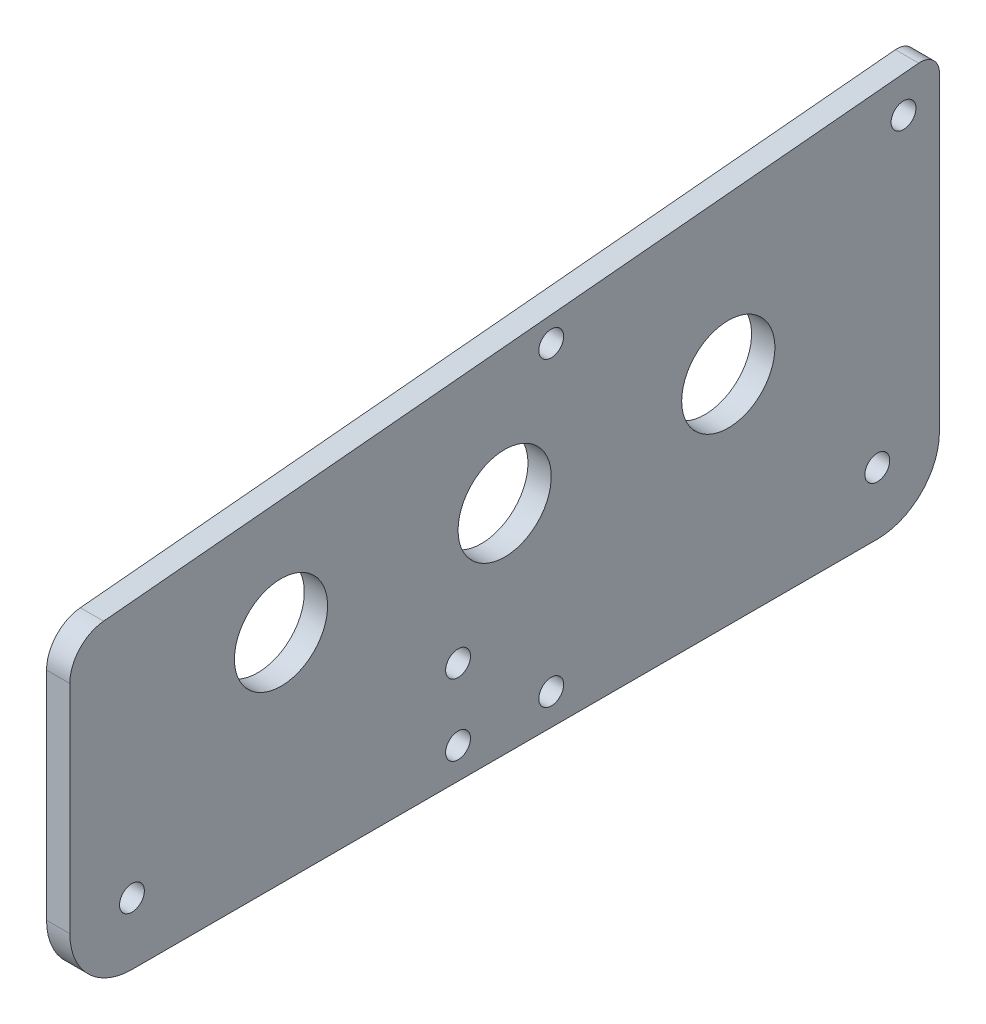
ISO-10303-21;
HEADER;
FILE_DESCRIPTION(('STEP AP214'),'2;1');
FILE_NAME('part.step','',(''),(''),'','','');
FILE_SCHEMA(('AUTOMOTIVE_DESIGN { 1 0 10303 214 1 1 1 1 }'));
ENDSEC;
DATA;
#1=APPLICATION_CONTEXT('core data for automotive mechanical design processes');
#2=APPLICATION_PROTOCOL_DEFINITION('international standard','automotive_design',2000,#1);
#3=PRODUCT_CONTEXT('',#1,'mechanical');
#4=PRODUCT('Part','Part','',(#3));
#5=PRODUCT_RELATED_PRODUCT_CATEGORY('part','',(#4));
#6=PRODUCT_DEFINITION_FORMATION('','',#4);
#7=PRODUCT_DEFINITION_CONTEXT('part definition',#1,'design');
#8=PRODUCT_DEFINITION('design','',#6,#7);
#9=PRODUCT_DEFINITION_SHAPE('','',#8);
#10=(LENGTH_UNIT() NAMED_UNIT(*) SI_UNIT(.MILLI.,.METRE.));
#11=(NAMED_UNIT(*) PLANE_ANGLE_UNIT() SI_UNIT($,.RADIAN.));
#12=(NAMED_UNIT(*) SI_UNIT($,.STERADIAN.) SOLID_ANGLE_UNIT());
#13=UNCERTAINTY_MEASURE_WITH_UNIT(LENGTH_MEASURE(1.E-05),#10,'distance_accuracy_value','');
#14=(GEOMETRIC_REPRESENTATION_CONTEXT(3) GLOBAL_UNCERTAINTY_ASSIGNED_CONTEXT((#13)) GLOBAL_UNIT_ASSIGNED_CONTEXT((#10,
#11,#12)) REPRESENTATION_CONTEXT('',''));
#15=CARTESIAN_POINT('',(0.,0.,0.));
#16=DIRECTION('',(0.,0.,1.));
#17=DIRECTION('',(1.,0.,0.));
#18=AXIS2_PLACEMENT_3D('',#15,#16,#17);
#19=CARTESIAN_POINT('',(4.7625,43.2742885665233,519.572478048036));
#20=DIRECTION('',(1.,0.,0.));
#21=DIRECTION('',(0.,0.,1.));
#22=AXIS2_PLACEMENT_3D('',#19,#20,#21);
#23=CYLINDRICAL_SURFACE('',#22,12.7);
#24=DIRECTION('',(1.,0.,0.));
#25=VECTOR('',#24,1.);
#26=CARTESIAN_POINT('',(4.7625,43.2742885665234,506.872478048036));
#27=LINE('',#26,#25);
#28=CARTESIAN_POINT('',(0.,43.2742885665234,506.872478048036));
#29=VERTEX_POINT('',#28);
#30=CARTESIAN_POINT('',(4.7625,43.2742885665234,506.872478048036));
#31=VERTEX_POINT('',#30);
#32=EDGE_CURVE('E11',#29,#31,#27,.T.);
#33=ORIENTED_EDGE('',*,*,#32,.T.);
#34=CARTESIAN_POINT('',(4.7625,43.2742885665233,519.572478048036));
#35=DIRECTION('',(-1.,0.,0.));
#36=DIRECTION('',(0.,0.,1.));
#37=AXIS2_PLACEMENT_3D('',#34,#35,#36);
#38=CIRCLE('',#37,12.7);
#39=CARTESIAN_POINT('',(4.7625,30.5742885665233,519.572478048036));
#40=VERTEX_POINT('',#39);
#41=EDGE_CURVE('E189',#31,#40,#38,.T.);
#42=ORIENTED_EDGE('',*,*,#41,.T.);
#43=DIRECTION('',(1.,0.,0.));
#44=VECTOR('',#43,1.);
#45=CARTESIAN_POINT('',(4.7625,30.5742885665233,519.572478048036));
#46=LINE('',#45,#44);
#47=CARTESIAN_POINT('',(0.,30.5742885665233,519.572478048036));
#48=VERTEX_POINT('',#47);
#49=EDGE_CURVE('E47',#48,#40,#46,.T.);
#50=ORIENTED_EDGE('',*,*,#49,.F.);
#51=CARTESIAN_POINT('',(0.,43.2742885665233,519.572478048036));
#52=DIRECTION('',(-1.,0.,0.));
#53=DIRECTION('',(0.,0.,1.));
#54=AXIS2_PLACEMENT_3D('',#51,#52,#53);
#55=CIRCLE('',#54,12.7);
#56=EDGE_CURVE('E93',#29,#48,#55,.T.);
#57=ORIENTED_EDGE('',*,*,#56,.F.);
#58=EDGE_LOOP('',(#33,#42,#50,#57));
#59=FACE_BOUND('',#58,.T.);
#60=ADVANCED_FACE('F37',(#59),#23,.T.);
#61=CARTESIAN_POINT('',(4.7625,30.5742885665233,671.972478048036));
#62=DIRECTION('',(0.,-1.,0.));
#63=DIRECTION('',(0.,0.,1.));
#64=AXIS2_PLACEMENT_3D('',#61,#62,#63);
#65=PLANE('',#64);
#66=ORIENTED_EDGE('',*,*,#49,.T.);
#67=DIRECTION('',(0.,0.,1.));
#68=VECTOR('',#67,1.);
#69=CARTESIAN_POINT('',(4.7625,30.5742885665233,671.972478048036));
#70=LINE('',#69,#68);
#71=CARTESIAN_POINT('',(4.7625,30.5742885665233,671.972478048036));
#72=VERTEX_POINT('',#71);
#73=EDGE_CURVE('E184',#40,#72,#70,.T.);
#74=ORIENTED_EDGE('',*,*,#73,.T.);
#75=DIRECTION('',(1.,0.,0.));
#76=VECTOR('',#75,1.);
#77=CARTESIAN_POINT('',(4.7625,30.5742885665233,671.972478048036));
#78=LINE('',#77,#76);
#79=CARTESIAN_POINT('',(0.,30.5742885665233,671.972478048036));
#80=VERTEX_POINT('',#79);
#81=EDGE_CURVE('E171',#80,#72,#78,.T.);
#82=ORIENTED_EDGE('',*,*,#81,.F.);
#83=DIRECTION('',(0.,0.,1.));
#84=VECTOR('',#83,1.);
#85=CARTESIAN_POINT('',(0.,30.5742885665233,510.75512339621));
#86=LINE('',#85,#84);
#87=EDGE_CURVE('E144',#48,#80,#86,.T.);
#88=ORIENTED_EDGE('',*,*,#87,.F.);
#89=EDGE_LOOP('',(#66,#74,#82,#88));
#90=FACE_BOUND('',#89,.T.);
#91=ADVANCED_FACE('F180',(#90),#65,.T.);
#92=CARTESIAN_POINT('',(4.7625,43.2742885665233,671.972478048036));
#93=DIRECTION('',(1.,0.,0.));
#94=DIRECTION('',(0.,0.,1.));
#95=AXIS2_PLACEMENT_3D('',#92,#93,#94);
#96=CYLINDRICAL_SURFACE('',#95,12.7);
#97=ORIENTED_EDGE('',*,*,#81,.T.);
#98=CARTESIAN_POINT('',(4.7625,43.2742885665233,671.972478048036));
#99=DIRECTION('',(-1.,0.,0.));
#100=DIRECTION('',(0.,0.,1.));
#101=AXIS2_PLACEMENT_3D('',#98,#99,#100);
#102=CIRCLE('',#101,12.7);
#103=CARTESIAN_POINT('',(4.7625,43.2742885665234,684.672478048036));
#104=VERTEX_POINT('',#103);
#105=EDGE_CURVE('E192',#72,#104,#102,.T.);
#106=ORIENTED_EDGE('',*,*,#105,.T.);
#107=DIRECTION('',(1.,0.,0.));
#108=VECTOR('',#107,1.);
#109=CARTESIAN_POINT('',(4.7625,43.2742885665234,684.672478048036));
#110=LINE('',#109,#108);
#111=CARTESIAN_POINT('',(0.,43.2742885665234,684.672478048036));
#112=VERTEX_POINT('',#111);
#113=EDGE_CURVE('E168',#112,#104,#110,.T.);
#114=ORIENTED_EDGE('',*,*,#113,.F.);
#115=CARTESIAN_POINT('',(0.,43.2742885665233,671.972478048036));
#116=DIRECTION('',(-1.,0.,0.));
#117=DIRECTION('',(0.,0.,1.));
#118=AXIS2_PLACEMENT_3D('',#115,#116,#117);
#119=CIRCLE('',#118,12.7);
#120=EDGE_CURVE('E141',#80,#112,#119,.T.);
#121=ORIENTED_EDGE('',*,*,#120,.F.);
#122=EDGE_LOOP('',(#97,#106,#114,#121));
#123=FACE_BOUND('',#122,.T.);
#124=ADVANCED_FACE('F249',(#123),#96,.T.);
#125=CARTESIAN_POINT('',(4.7625,87.5685067589977,684.672478048036));
#126=DIRECTION('',(0.,0.,1.));
#127=DIRECTION('',(0.,1.,0.));
#128=AXIS2_PLACEMENT_3D('',#125,#126,#127);
#129=PLANE('',#128);
#130=ORIENTED_EDGE('',*,*,#113,.T.);
#131=DIRECTION('',(0.,1.,0.));
#132=VECTOR('',#131,1.);
#133=CARTESIAN_POINT('',(4.7625,87.5685067589977,684.672478048036));
#134=LINE('',#133,#132);
#135=CARTESIAN_POINT('',(4.7625,87.5685067589977,684.672478048036));
#136=VERTEX_POINT('',#135);
#137=EDGE_CURVE('E199',#104,#136,#134,.T.);
#138=ORIENTED_EDGE('',*,*,#137,.T.);
#139=DIRECTION('',(1.,0.,0.));
#140=VECTOR('',#139,1.);
#141=CARTESIAN_POINT('',(4.7625,87.5685067589977,684.672478048036));
#142=LINE('',#141,#140);
#143=CARTESIAN_POINT('',(0.,87.5685067589977,684.672478048036));
#144=VERTEX_POINT('',#143);
#145=EDGE_CURVE('E165',#144,#136,#142,.T.);
#146=ORIENTED_EDGE('',*,*,#145,.F.);
#147=DIRECTION('',(0.,1.,0.));
#148=VECTOR('',#147,1.);
#149=CARTESIAN_POINT('',(0.,106.774288566523,684.672478048036));
#150=LINE('',#149,#148);
#151=EDGE_CURVE('E138',#112,#144,#150,.T.);
#152=ORIENTED_EDGE('',*,*,#151,.F.);
#153=EDGE_LOOP('',(#130,#138,#146,#152));
#154=FACE_BOUND('',#153,.T.);
#155=ADVANCED_FACE('F339',(#154),#129,.T.);
#156=CARTESIAN_POINT('',(4.7625,87.5685067589978,677.052478048036));
#157=DIRECTION('',(1.,0.,0.));
#158=DIRECTION('',(0.,0.,1.));
#159=AXIS2_PLACEMENT_3D('',#156,#157,#158);
#160=CYLINDRICAL_SURFACE('',#159,7.61999999999997);
#161=ORIENTED_EDGE('',*,*,#145,.T.);
#162=CARTESIAN_POINT('',(4.7625,87.5685067589978,677.052478048036));
#163=DIRECTION('',(-1.,0.,0.));
#164=DIRECTION('',(0.,0.,1.));
#165=AXIS2_PLACEMENT_3D('',#162,#163,#164);
#166=CIRCLE('',#165,7.61999999999997);
#167=CARTESIAN_POINT('',(4.7625,95.1558223329558,677.757490375002));
#168=VERTEX_POINT('',#167);
#169=EDGE_CURVE('E202',#136,#168,#166,.T.);
#170=ORIENTED_EDGE('',*,*,#169,.T.);
#171=DIRECTION('',(1.,0.,0.));
#172=VECTOR('',#171,1.);
#173=CARTESIAN_POINT('',(4.7625,95.1558223329558,677.757490375002));
#174=LINE('',#173,#172);
#175=CARTESIAN_POINT('',(0.,95.1558223329558,677.757490375002));
#176=VERTEX_POINT('',#175);
#177=EDGE_CURVE('E108',#176,#168,#174,.T.);
#178=ORIENTED_EDGE('',*,*,#177,.F.);
#179=CARTESIAN_POINT('',(0.,87.5685067589978,677.052478048036));
#180=DIRECTION('',(-1.,0.,0.));
#181=DIRECTION('',(0.,0.,1.));
#182=AXIS2_PLACEMENT_3D('',#179,#180,#181);
#183=CIRCLE('',#182,7.61999999999997);
#184=EDGE_CURVE('E136',#144,#176,#183,.T.);
#185=ORIENTED_EDGE('',*,*,#184,.F.);
#186=EDGE_LOOP('',(#161,#170,#178,#185));
#187=FACE_BOUND('',#186,.T.);
#188=ADVANCED_FACE('F351',(#187),#160,.T.);
#189=CARTESIAN_POINT('',(4.7625,110.640280104365,511.114350801944));
#190=DIRECTION('',(0.,0.995710705243837,0.0925213027514315));
#191=DIRECTION('',(0.,0.0925213027514315,-0.995710705243836));
#192=AXIS2_PLACEMENT_3D('',#189,#190,#191);
#193=PLANE('',#192);
#194=ORIENTED_EDGE('',*,*,#177,.T.);
#195=DIRECTION('',(0.,0.0925213027514315,-0.995710705243836));
#196=VECTOR('',#195,1.);
#197=CARTESIAN_POINT('',(4.7625,110.640280104365,511.114350801944));
#198=LINE('',#197,#196);
#199=CARTESIAN_POINT('',(4.7625,110.640280104365,511.114350801944));
#200=VERTEX_POINT('',#199);
#201=EDGE_CURVE('E205',#168,#200,#198,.T.);
#202=ORIENTED_EDGE('',*,*,#201,.T.);
#203=DIRECTION('',(1.,0.,0.));
#204=VECTOR('',#203,1.);
#205=CARTESIAN_POINT('',(4.7625,110.640280104365,511.114350801944));
#206=LINE('',#205,#204);
#207=CARTESIAN_POINT('',(0.,110.640280104365,511.114350801944));
#208=VERTEX_POINT('',#207);
#209=EDGE_CURVE('E106',#208,#200,#206,.T.);
#210=ORIENTED_EDGE('',*,*,#209,.F.);
#211=DIRECTION('',(0.,0.0925213027514315,-0.995710705243836));
#212=VECTOR('',#211,1.);
#213=CARTESIAN_POINT('',(0.,110.640280104365,511.114350801944));
#214=LINE('',#213,#212);
#215=EDGE_CURVE('E100',#176,#208,#214,.T.);
#216=ORIENTED_EDGE('',*,*,#215,.F.);
#217=EDGE_LOOP('',(#194,#202,#210,#216));
#218=FACE_BOUND('',#217,.T.);
#219=ADVANCED_FACE('F364',(#218),#193,.T.);
#220=CARTESIAN_POINT('',(4.7625,106.774288566523,510.75512339621));
#221=DIRECTION('',(1.,0.,0.));
#222=DIRECTION('',(0.,0.,1.));
#223=AXIS2_PLACEMENT_3D('',#220,#221,#222);
#224=CYLINDRICAL_SURFACE('',#223,3.8826453481733);
#225=ORIENTED_EDGE('',*,*,#209,.T.);
#226=CARTESIAN_POINT('',(4.7625,106.774288566523,510.75512339621));
#227=DIRECTION('',(-1.,0.,0.));
#228=DIRECTION('',(0.,0.,1.));
#229=AXIS2_PLACEMENT_3D('',#226,#227,#228);
#230=CIRCLE('',#229,3.8826453481733);
#231=CARTESIAN_POINT('',(4.7625,106.774288566523,506.872478048036));
#232=VERTEX_POINT('',#231);
#233=EDGE_CURVE('E55',#200,#232,#230,.T.);
#234=ORIENTED_EDGE('',*,*,#233,.T.);
#235=DIRECTION('',(1.,0.,0.));
#236=VECTOR('',#235,1.);
#237=CARTESIAN_POINT('',(4.7625,106.774288566523,506.872478048036));
#238=LINE('',#237,#236);
#239=CARTESIAN_POINT('',(0.,106.774288566523,506.872478048036));
#240=VERTEX_POINT('',#239);
#241=EDGE_CURVE('E41',#240,#232,#238,.T.);
#242=ORIENTED_EDGE('',*,*,#241,.F.);
#243=CARTESIAN_POINT('',(0.,106.774288566523,510.75512339621));
#244=DIRECTION('',(-1.,0.,0.));
#245=DIRECTION('',(0.,0.,1.));
#246=AXIS2_PLACEMENT_3D('',#243,#244,#245);
#247=CIRCLE('',#246,3.8826453481733);
#248=EDGE_CURVE('E94',#208,#240,#247,.T.);
#249=ORIENTED_EDGE('',*,*,#248,.F.);
#250=EDGE_LOOP('',(#225,#234,#242,#249));
#251=FACE_BOUND('',#250,.T.);
#252=ADVANCED_FACE('F105',(#251),#224,.T.);
#253=CARTESIAN_POINT('',(4.7625,43.2742885665233,519.572478048036));
#254=DIRECTION('',(1.,0.,0.));
#255=DIRECTION('',(0.,0.,1.));
#256=AXIS2_PLACEMENT_3D('',#253,#254,#255);
#257=CYLINDRICAL_SURFACE('',#256,2.53999999999995);
#258=CARTESIAN_POINT('',(4.7625,43.2742885665233,519.572478048036));
#259=DIRECTION('',(-1.,0.,0.));
#260=DIRECTION('',(0.,0.,1.));
#261=AXIS2_PLACEMENT_3D('',#258,#259,#260);
#262=CIRCLE('',#261,2.53999999999995);
#263=CARTESIAN_POINT('',(4.7625,43.2742885665233,522.112478048036));
#264=VERTEX_POINT('',#263);
#265=EDGE_CURVE('E161',#264,#264,#262,.T.);
#266=ORIENTED_EDGE('',*,*,#265,.F.);
#267=EDGE_LOOP('',(#266));
#268=FACE_BOUND('',#267,.T.);
#269=CARTESIAN_POINT('',(0.,43.2742885665233,519.572478048036));
#270=DIRECTION('',(-1.,0.,0.));
#271=DIRECTION('',(0.,0.,1.));
#272=AXIS2_PLACEMENT_3D('',#269,#270,#271);
#273=CIRCLE('',#272,2.53999999999995);
#274=CARTESIAN_POINT('',(0.,43.2742885665233,522.112478048036));
#275=VERTEX_POINT('',#274);
#276=EDGE_CURVE('E120',#275,#275,#273,.T.);
#277=ORIENTED_EDGE('',*,*,#276,.T.);
#278=EDGE_LOOP('',(#277));
#279=FACE_BOUND('',#278,.T.);
#280=ADVANCED_FACE('F308',(#268,#279),#257,.F.);
#281=CARTESIAN_POINT('',(4.7625,36.9242885665233,605.297478048037));
#282=DIRECTION('',(1.,0.,0.));
#283=DIRECTION('',(0.,0.,1.));
#284=AXIS2_PLACEMENT_3D('',#281,#282,#283);
#285=CYLINDRICAL_SURFACE('',#284,2.53999999999995);
#286=CARTESIAN_POINT('',(4.7625,36.9242885665233,605.297478048037));
#287=DIRECTION('',(-1.,0.,0.));
#288=DIRECTION('',(0.,0.,1.));
#289=AXIS2_PLACEMENT_3D('',#286,#287,#288);
#290=CIRCLE('',#289,2.53999999999995);
#291=CARTESIAN_POINT('',(4.7625,36.9242885665233,607.837478048037));
#292=VERTEX_POINT('',#291);
#293=EDGE_CURVE('E527',#292,#292,#290,.T.);
#294=ORIENTED_EDGE('',*,*,#293,.F.);
#295=EDGE_LOOP('',(#294));
#296=FACE_BOUND('',#295,.T.);
#297=CARTESIAN_POINT('',(0.,36.9242885665233,605.297478048037));
#298=DIRECTION('',(-1.,0.,0.));
#299=DIRECTION('',(0.,0.,1.));
#300=AXIS2_PLACEMENT_3D('',#297,#298,#299);
#301=CIRCLE('',#300,2.53999999999995);
#302=CARTESIAN_POINT('',(0.,36.9242885665233,607.837478048037));
#303=VERTEX_POINT('',#302);
#304=EDGE_CURVE('E123',#303,#303,#301,.T.);
#305=ORIENTED_EDGE('',*,*,#304,.T.);
#306=EDGE_LOOP('',(#305));
#307=FACE_BOUND('',#306,.T.);
#308=ADVANCED_FACE('F313',(#296,#307),#285,.F.);
#309=CARTESIAN_POINT('',(4.7625,98.570718763052,586.247478048036));
#310=DIRECTION('',(1.,0.,0.));
#311=DIRECTION('',(0.,0.,1.));
#312=AXIS2_PLACEMENT_3D('',#309,#310,#311);
#313=CYLINDRICAL_SURFACE('',#312,2.53999999999995);
#314=CARTESIAN_POINT('',(4.7625,98.570718763052,586.247478048036));
#315=DIRECTION('',(-1.,0.,0.));
#316=DIRECTION('',(0.,0.,1.));
#317=AXIS2_PLACEMENT_3D('',#314,#315,#316);
#318=CIRCLE('',#317,2.53999999999995);
#319=CARTESIAN_POINT('',(4.7625,98.570718763052,588.787478048036));
#320=VERTEX_POINT('',#319);
#321=EDGE_CURVE('E522',#320,#320,#318,.T.);
#322=ORIENTED_EDGE('',*,*,#321,.F.);
#323=EDGE_LOOP('',(#322));
#324=FACE_BOUND('',#323,.T.);
#325=CARTESIAN_POINT('',(0.,98.570718763052,586.247478048036));
#326=DIRECTION('',(-1.,0.,0.));
#327=DIRECTION('',(0.,0.,1.));
#328=AXIS2_PLACEMENT_3D('',#325,#326,#327);
#329=CIRCLE('',#328,2.53999999999995);
#330=CARTESIAN_POINT('',(0.,98.570718763052,588.787478048036));
#331=VERTEX_POINT('',#330);
#332=EDGE_CURVE('E126',#331,#331,#329,.T.);
#333=ORIENTED_EDGE('',*,*,#332,.T.);
#334=EDGE_LOOP('',(#333));
#335=FACE_BOUND('',#334,.T.);
#336=ADVANCED_FACE('F326',(#324,#335),#313,.F.);
#337=CARTESIAN_POINT('',(4.7625,75.0242885665233,595.772478048036));
#338=DIRECTION('',(1.,0.,0.));
#339=DIRECTION('',(0.,0.,1.));
#340=AXIS2_PLACEMENT_3D('',#337,#338,#339);
#341=CYLINDRICAL_SURFACE('',#340,9.52500000000002);
#342=CARTESIAN_POINT('',(4.7625,75.0242885665233,595.772478048036));
#343=DIRECTION('',(-1.,0.,0.));
#344=DIRECTION('',(0.,0.,1.));
#345=AXIS2_PLACEMENT_3D('',#342,#343,#344);
#346=CIRCLE('',#345,9.52500000000002);
#347=CARTESIAN_POINT('',(4.7625,75.0242885665233,605.297478048036));
#348=VERTEX_POINT('',#347);
#349=EDGE_CURVE('E519',#348,#348,#346,.T.);
#350=ORIENTED_EDGE('',*,*,#349,.F.);
#351=EDGE_LOOP('',(#350));
#352=FACE_BOUND('',#351,.T.);
#353=CARTESIAN_POINT('',(0.,75.0242885665233,595.772478048036));
#354=DIRECTION('',(-1.,0.,0.));
#355=DIRECTION('',(0.,0.,1.));
#356=AXIS2_PLACEMENT_3D('',#353,#354,#355);
#357=CIRCLE('',#356,9.52500000000002);
#358=CARTESIAN_POINT('',(0.,75.0242885665233,605.297478048036));
#359=VERTEX_POINT('',#358);
#360=EDGE_CURVE('E129',#359,#359,#357,.T.);
#361=ORIENTED_EDGE('',*,*,#360,.T.);
#362=EDGE_LOOP('',(#361));
#363=FACE_BOUND('',#362,.T.);
#364=ADVANCED_FACE('F406',(#352,#363),#341,.F.);
#365=CARTESIAN_POINT('',(4.7625,102.974522609859,514.218184144722));
#366=DIRECTION('',(1.,0.,0.));
#367=DIRECTION('',(0.,0.,1.));
#368=AXIS2_PLACEMENT_3D('',#365,#366,#367);
#369=CYLINDRICAL_SURFACE('',#368,2.53999999999995);
#370=CARTESIAN_POINT('',(4.7625,102.974522609859,514.218184144722));
#371=DIRECTION('',(-1.,0.,0.));
#372=DIRECTION('',(0.,0.,1.));
#373=AXIS2_PLACEMENT_3D('',#370,#371,#372);
#374=CIRCLE('',#373,2.53999999999995);
#375=CARTESIAN_POINT('',(4.7625,102.974522609859,516.758184144722));
#376=VERTEX_POINT('',#375);
#377=EDGE_CURVE('E515',#376,#376,#374,.T.);
#378=ORIENTED_EDGE('',*,*,#377,.F.);
#379=EDGE_LOOP('',(#378));
#380=FACE_BOUND('',#379,.T.);
#381=CARTESIAN_POINT('',(0.,102.974522609859,514.218184144722));
#382=DIRECTION('',(-1.,0.,0.));
#383=DIRECTION('',(0.,0.,1.));
#384=AXIS2_PLACEMENT_3D('',#381,#382,#383);
#385=CIRCLE('',#384,2.53999999999995);
#386=CARTESIAN_POINT('',(0.,102.974522609859,516.758184144722));
#387=VERTEX_POINT('',#386);
#388=EDGE_CURVE('E103',#387,#387,#385,.T.);
#389=ORIENTED_EDGE('',*,*,#388,.T.);
#390=EDGE_LOOP('',(#389));
#391=FACE_BOUND('',#390,.T.);
#392=ADVANCED_FACE('F256',(#380,#391),#369,.F.);
#393=CARTESIAN_POINT('',(4.7625,43.2742885665234,506.872478048036));
#394=DIRECTION('',(0.,0.,-1.));
#395=DIRECTION('',(0.,-1.,0.));
#396=AXIS2_PLACEMENT_3D('',#393,#394,#395);
#397=PLANE('',#396);
#398=DIRECTION('',(0.,1.,0.));
#399=VECTOR('',#398,1.);
#400=CARTESIAN_POINT('',(0.,106.774288566523,506.872478048036));
#401=LINE('',#400,#399);
#402=EDGE_CURVE('E85',#240,#29,#401,.F.);
#403=ORIENTED_EDGE('',*,*,#402,.F.);
#404=ORIENTED_EDGE('',*,*,#241,.T.);
#405=DIRECTION('',(0.,-1.,0.));
#406=VECTOR('',#405,1.);
#407=CARTESIAN_POINT('',(4.7625,43.2742885665234,506.872478048036));
#408=LINE('',#407,#406);
#409=EDGE_CURVE('E190',#232,#31,#408,.T.);
#410=ORIENTED_EDGE('',*,*,#409,.T.);
#411=ORIENTED_EDGE('',*,*,#32,.F.);
#412=EDGE_LOOP('',(#403,#404,#410,#411));
#413=FACE_BOUND('',#412,.T.);
#414=ADVANCED_FACE('F90',(#413),#397,.T.);
#415=CARTESIAN_POINT('',(4.7625,75.0242885665233,550.052478048036));
#416=DIRECTION('',(1.,0.,0.));
#417=DIRECTION('',(0.,0.,1.));
#418=AXIS2_PLACEMENT_3D('',#415,#416,#417);
#419=CYLINDRICAL_SURFACE('',#418,9.52500000000002);
#420=CARTESIAN_POINT('',(4.7625,75.0242885665233,550.052478048036));
#421=DIRECTION('',(-1.,0.,0.));
#422=DIRECTION('',(0.,0.,1.));
#423=AXIS2_PLACEMENT_3D('',#420,#421,#422);
#424=CIRCLE('',#423,9.52500000000002);
#425=CARTESIAN_POINT('',(4.7625,75.0242885665233,559.577478048036));
#426=VERTEX_POINT('',#425);
#427=EDGE_CURVE('E208',#426,#426,#424,.T.);
#428=ORIENTED_EDGE('',*,*,#427,.F.);
#429=EDGE_LOOP('',(#428));
#430=FACE_BOUND('',#429,.T.);
#431=CARTESIAN_POINT('',(0.,75.0242885665233,550.052478048036));
#432=DIRECTION('',(-1.,0.,0.));
#433=DIRECTION('',(0.,0.,1.));
#434=AXIS2_PLACEMENT_3D('',#431,#432,#433);
#435=CIRCLE('',#434,9.52500000000002);
#436=CARTESIAN_POINT('',(0.,75.0242885665233,559.577478048036));
#437=VERTEX_POINT('',#436);
#438=EDGE_CURVE('E135',#437,#437,#435,.T.);
#439=ORIENTED_EDGE('',*,*,#438,.T.);
#440=EDGE_LOOP('',(#439));
#441=FACE_BOUND('',#440,.T.);
#442=ADVANCED_FACE('F255',(#430,#441),#419,.F.);
#443=CARTESIAN_POINT('',(4.7625,51.4778583699946,605.297478048036));
#444=DIRECTION('',(1.,0.,0.));
#445=DIRECTION('',(0.,0.,1.));
#446=AXIS2_PLACEMENT_3D('',#443,#444,#445);
#447=CYLINDRICAL_SURFACE('',#446,2.54000000000007);
#448=CARTESIAN_POINT('',(4.7625,51.4778583699946,605.297478048036));
#449=DIRECTION('',(-1.,0.,0.));
#450=DIRECTION('',(0.,0.,1.));
#451=AXIS2_PLACEMENT_3D('',#448,#449,#450);
#452=CIRCLE('',#451,2.54000000000007);
#453=CARTESIAN_POINT('',(4.7625,51.4778583699946,607.837478048036));
#454=VERTEX_POINT('',#453);
#455=EDGE_CURVE('E211',#454,#454,#452,.T.);
#456=ORIENTED_EDGE('',*,*,#455,.F.);
#457=EDGE_LOOP('',(#456));
#458=FACE_BOUND('',#457,.T.);
#459=CARTESIAN_POINT('',(0.,51.4778583699946,605.297478048036));
#460=DIRECTION('',(-1.,0.,0.));
#461=DIRECTION('',(0.,0.,1.));
#462=AXIS2_PLACEMENT_3D('',#459,#460,#461);
#463=CIRCLE('',#462,2.54000000000007);
#464=CARTESIAN_POINT('',(0.,51.4778583699946,607.837478048036));
#465=VERTEX_POINT('',#464);
#466=EDGE_CURVE('E150',#465,#465,#463,.T.);
#467=ORIENTED_EDGE('',*,*,#466,.T.);
#468=EDGE_LOOP('',(#467));
#469=FACE_BOUND('',#468,.T.);
#470=ADVANCED_FACE('F223',(#458,#469),#447,.F.);
#471=CARTESIAN_POINT('',(4.7625,75.0242885665233,641.492478048036));
#472=DIRECTION('',(1.,0.,0.));
#473=DIRECTION('',(0.,0.,1.));
#474=AXIS2_PLACEMENT_3D('',#471,#472,#473);
#475=CYLINDRICAL_SURFACE('',#474,9.52500000000002);
#476=CARTESIAN_POINT('',(4.7625,75.0242885665233,641.492478048036));
#477=DIRECTION('',(-1.,0.,0.));
#478=DIRECTION('',(0.,0.,1.));
#479=AXIS2_PLACEMENT_3D('',#476,#477,#478);
#480=CIRCLE('',#479,9.52500000000002);
#481=CARTESIAN_POINT('',(4.7625,75.0242885665233,651.017478048036));
#482=VERTEX_POINT('',#481);
#483=EDGE_CURVE('E116',#482,#482,#480,.T.);
#484=ORIENTED_EDGE('',*,*,#483,.F.);
#485=EDGE_LOOP('',(#484));
#486=FACE_BOUND('',#485,.T.);
#487=CARTESIAN_POINT('',(0.,75.0242885665233,641.492478048036));
#488=DIRECTION('',(-1.,0.,0.));
#489=DIRECTION('',(0.,0.,1.));
#490=AXIS2_PLACEMENT_3D('',#487,#488,#489);
#491=CIRCLE('',#490,9.52500000000002);
#492=CARTESIAN_POINT('',(0.,75.0242885665233,651.017478048036));
#493=VERTEX_POINT('',#492);
#494=EDGE_CURVE('E153',#493,#493,#491,.T.);
#495=ORIENTED_EDGE('',*,*,#494,.T.);
#496=EDGE_LOOP('',(#495));
#497=FACE_BOUND('',#496,.T.);
#498=ADVANCED_FACE('F219',(#486,#497),#475,.F.);
#499=CARTESIAN_POINT('',(4.7625,36.9242885665233,586.247478048036));
#500=DIRECTION('',(1.,0.,0.));
#501=DIRECTION('',(0.,0.,1.));
#502=AXIS2_PLACEMENT_3D('',#499,#500,#501);
#503=CYLINDRICAL_SURFACE('',#502,2.53999999999995);
#504=CARTESIAN_POINT('',(4.7625,36.9242885665233,586.247478048036));
#505=DIRECTION('',(-1.,0.,0.));
#506=DIRECTION('',(0.,0.,1.));
#507=AXIS2_PLACEMENT_3D('',#504,#505,#506);
#508=CIRCLE('',#507,2.53999999999995);
#509=CARTESIAN_POINT('',(4.7625,36.9242885665233,588.787478048036));
#510=VERTEX_POINT('',#509);
#511=EDGE_CURVE('E111',#510,#510,#508,.T.);
#512=ORIENTED_EDGE('',*,*,#511,.F.);
#513=EDGE_LOOP('',(#512));
#514=FACE_BOUND('',#513,.T.);
#515=CARTESIAN_POINT('',(0.,36.9242885665233,586.247478048036));
#516=DIRECTION('',(-1.,0.,0.));
#517=DIRECTION('',(0.,0.,1.));
#518=AXIS2_PLACEMENT_3D('',#515,#516,#517);
#519=CIRCLE('',#518,2.53999999999995);
#520=CARTESIAN_POINT('',(0.,36.9242885665233,588.787478048036));
#521=VERTEX_POINT('',#520);
#522=EDGE_CURVE('E156',#521,#521,#519,.T.);
#523=ORIENTED_EDGE('',*,*,#522,.T.);
#524=EDGE_LOOP('',(#523));
#525=FACE_BOUND('',#524,.T.);
#526=ADVANCED_FACE('F222',(#514,#525),#503,.F.);
#527=CARTESIAN_POINT('',(4.7625,43.2742885665233,671.972478048036));
#528=DIRECTION('',(1.,0.,0.));
#529=DIRECTION('',(0.,0.,1.));
#530=AXIS2_PLACEMENT_3D('',#527,#528,#529);
#531=CYLINDRICAL_SURFACE('',#530,2.53999999999995);
#532=CARTESIAN_POINT('',(4.7625,43.2742885665233,671.972478048036));
#533=DIRECTION('',(-1.,0.,0.));
#534=DIRECTION('',(0.,0.,1.));
#535=AXIS2_PLACEMENT_3D('',#532,#533,#534);
#536=CIRCLE('',#535,2.53999999999995);
#537=CARTESIAN_POINT('',(4.7625,43.2742885665233,674.512478048036));
#538=VERTEX_POINT('',#537);
#539=EDGE_CURVE('E107',#538,#538,#536,.T.);
#540=ORIENTED_EDGE('',*,*,#539,.F.);
#541=EDGE_LOOP('',(#540));
#542=FACE_BOUND('',#541,.T.);
#543=CARTESIAN_POINT('',(0.,43.2742885665233,671.972478048036));
#544=DIRECTION('',(-1.,0.,0.));
#545=DIRECTION('',(0.,0.,1.));
#546=AXIS2_PLACEMENT_3D('',#543,#544,#545);
#547=CIRCLE('',#546,2.53999999999995);
#548=CARTESIAN_POINT('',(0.,43.2742885665233,674.512478048036));
#549=VERTEX_POINT('',#548);
#550=EDGE_CURVE('E159',#549,#549,#547,.T.);
#551=ORIENTED_EDGE('',*,*,#550,.T.);
#552=EDGE_LOOP('',(#551));
#553=FACE_BOUND('',#552,.T.);
#554=ADVANCED_FACE('F39',(#542,#553),#531,.F.);
#555=CARTESIAN_POINT('',(4.7625,106.774288566523,510.75512339621));
#556=DIRECTION('',(1.,0.,0.));
#557=DIRECTION('',(0.,0.,1.));
#558=AXIS2_PLACEMENT_3D('',#555,#556,#557);
#559=PLANE('',#558);
#560=ORIENTED_EDGE('',*,*,#265,.T.);
#561=EDGE_LOOP('',(#560));
#562=FACE_BOUND('',#561,.T.);
#563=ORIENTED_EDGE('',*,*,#293,.T.);
#564=EDGE_LOOP('',(#563));
#565=FACE_BOUND('',#564,.T.);
#566=ORIENTED_EDGE('',*,*,#321,.T.);
#567=EDGE_LOOP('',(#566));
#568=FACE_BOUND('',#567,.T.);
#569=ORIENTED_EDGE('',*,*,#349,.T.);
#570=EDGE_LOOP('',(#569));
#571=FACE_BOUND('',#570,.T.);
#572=ORIENTED_EDGE('',*,*,#377,.T.);
#573=EDGE_LOOP('',(#572));
#574=FACE_BOUND('',#573,.T.);
#575=ORIENTED_EDGE('',*,*,#233,.F.);
#576=ORIENTED_EDGE('',*,*,#201,.F.);
#577=ORIENTED_EDGE('',*,*,#169,.F.);
#578=ORIENTED_EDGE('',*,*,#137,.F.);
#579=ORIENTED_EDGE('',*,*,#105,.F.);
#580=ORIENTED_EDGE('',*,*,#73,.F.);
#581=ORIENTED_EDGE('',*,*,#41,.F.);
#582=ORIENTED_EDGE('',*,*,#409,.F.);
#583=EDGE_LOOP('',(#575,#576,#577,#578,#579,#580,#581,#582));
#584=FACE_BOUND('',#583,.T.);
#585=ORIENTED_EDGE('',*,*,#427,.T.);
#586=EDGE_LOOP('',(#585));
#587=FACE_BOUND('',#586,.T.);
#588=ORIENTED_EDGE('',*,*,#455,.T.);
#589=EDGE_LOOP('',(#588));
#590=FACE_BOUND('',#589,.T.);
#591=ORIENTED_EDGE('',*,*,#483,.T.);
#592=EDGE_LOOP('',(#591));
#593=FACE_BOUND('',#592,.T.);
#594=ORIENTED_EDGE('',*,*,#511,.T.);
#595=EDGE_LOOP('',(#594));
#596=FACE_BOUND('',#595,.T.);
#597=ORIENTED_EDGE('',*,*,#539,.T.);
#598=EDGE_LOOP('',(#597));
#599=FACE_BOUND('',#598,.T.);
#600=ADVANCED_FACE('F216',(#562,#565,#568,#571,#574,#584,#587,#590,#593,#596,#599),#559,.T.);
#601=CARTESIAN_POINT('',(0.,106.774288566523,510.75512339621));
#602=DIRECTION('',(1.,0.,0.));
#603=DIRECTION('',(0.,0.,1.));
#604=AXIS2_PLACEMENT_3D('',#601,#602,#603);
#605=PLANE('',#604);
#606=ORIENTED_EDGE('',*,*,#276,.F.);
#607=EDGE_LOOP('',(#606));
#608=FACE_BOUND('',#607,.T.);
#609=ORIENTED_EDGE('',*,*,#304,.F.);
#610=EDGE_LOOP('',(#609));
#611=FACE_BOUND('',#610,.T.);
#612=ORIENTED_EDGE('',*,*,#332,.F.);
#613=EDGE_LOOP('',(#612));
#614=FACE_BOUND('',#613,.T.);
#615=ORIENTED_EDGE('',*,*,#360,.F.);
#616=EDGE_LOOP('',(#615));
#617=FACE_BOUND('',#616,.T.);
#618=ORIENTED_EDGE('',*,*,#388,.F.);
#619=EDGE_LOOP('',(#618));
#620=FACE_BOUND('',#619,.T.);
#621=ORIENTED_EDGE('',*,*,#248,.T.);
#622=ORIENTED_EDGE('',*,*,#402,.T.);
#623=ORIENTED_EDGE('',*,*,#56,.T.);
#624=ORIENTED_EDGE('',*,*,#87,.T.);
#625=ORIENTED_EDGE('',*,*,#120,.T.);
#626=ORIENTED_EDGE('',*,*,#151,.T.);
#627=ORIENTED_EDGE('',*,*,#184,.T.);
#628=ORIENTED_EDGE('',*,*,#215,.T.);
#629=EDGE_LOOP('',(#621,#622,#623,#624,#625,#626,#627,#628));
#630=FACE_BOUND('',#629,.T.);
#631=ORIENTED_EDGE('',*,*,#438,.F.);
#632=EDGE_LOOP('',(#631));
#633=FACE_BOUND('',#632,.T.);
#634=ORIENTED_EDGE('',*,*,#466,.F.);
#635=EDGE_LOOP('',(#634));
#636=FACE_BOUND('',#635,.T.);
#637=ORIENTED_EDGE('',*,*,#494,.F.);
#638=EDGE_LOOP('',(#637));
#639=FACE_BOUND('',#638,.T.);
#640=ORIENTED_EDGE('',*,*,#522,.F.);
#641=EDGE_LOOP('',(#640));
#642=FACE_BOUND('',#641,.T.);
#643=ORIENTED_EDGE('',*,*,#550,.F.);
#644=EDGE_LOOP('',(#643));
#645=FACE_BOUND('',#644,.T.);
#646=ADVANCED_FACE('F97',(#608,#611,#614,#617,#620,#630,#633,#636,#639,#642,#645),#605,.F.);
#647=CLOSED_SHELL('',(#60,#91,#124,#155,#188,#219,#252,#280,#308,#336,#364,#392,#414,#442,#470,
#498,#526,#554,#600,#646));
#648=MANIFOLD_SOLID_BREP('B2',#647);
#649=ADVANCED_BREP_SHAPE_REPRESENTATION('',(#18,#648),#14);
#650=SHAPE_DEFINITION_REPRESENTATION(#9,#649);
ENDSEC;
END-ISO-10303-21;
